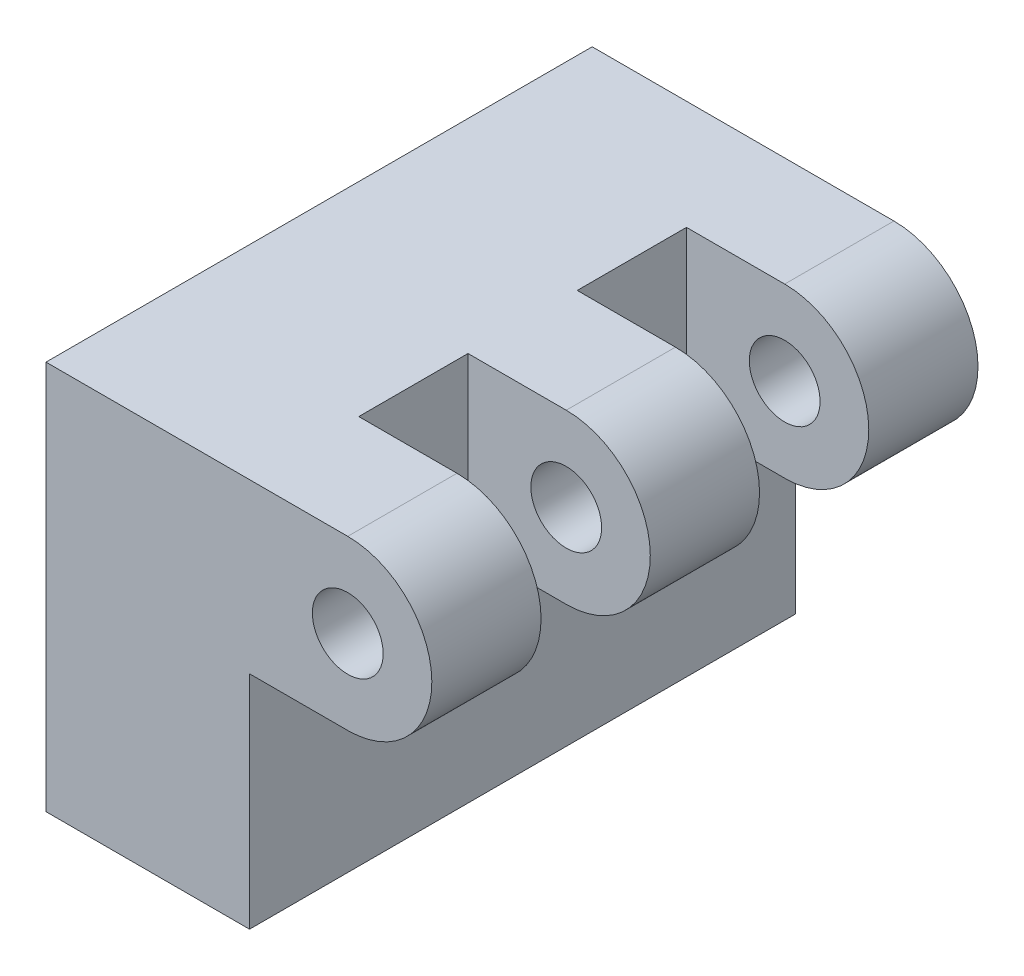
ISO-10303-21;
HEADER;
FILE_DESCRIPTION(('STEP AP214'),'2;1');
FILE_NAME('part.step','',(''),(''),'','','');
FILE_SCHEMA(('AUTOMOTIVE_DESIGN { 1 0 10303 214 1 1 1 1 }'));
ENDSEC;
DATA;
#1=APPLICATION_CONTEXT('core data for automotive mechanical design processes');
#2=APPLICATION_PROTOCOL_DEFINITION('international standard','automotive_design',2000,#1);
#3=PRODUCT_CONTEXT('',#1,'mechanical');
#4=PRODUCT('Part','Part','',(#3));
#5=PRODUCT_RELATED_PRODUCT_CATEGORY('part','',(#4));
#6=PRODUCT_DEFINITION_FORMATION('','',#4);
#7=PRODUCT_DEFINITION_CONTEXT('part definition',#1,'design');
#8=PRODUCT_DEFINITION('design','',#6,#7);
#9=PRODUCT_DEFINITION_SHAPE('','',#8);
#10=(LENGTH_UNIT() NAMED_UNIT(*) SI_UNIT(.MILLI.,.METRE.));
#11=(NAMED_UNIT(*) PLANE_ANGLE_UNIT() SI_UNIT($,.RADIAN.));
#12=(NAMED_UNIT(*) SI_UNIT($,.STERADIAN.) SOLID_ANGLE_UNIT());
#13=UNCERTAINTY_MEASURE_WITH_UNIT(LENGTH_MEASURE(1.E-05),#10,'distance_accuracy_value','');
#14=(GEOMETRIC_REPRESENTATION_CONTEXT(3) GLOBAL_UNCERTAINTY_ASSIGNED_CONTEXT((#13)) GLOBAL_UNIT_ASSIGNED_CONTEXT((#10,
#11,#12)) REPRESENTATION_CONTEXT('',''));
#15=CARTESIAN_POINT('',(0.,0.,0.));
#16=DIRECTION('',(0.,0.,1.));
#17=DIRECTION('',(1.,0.,0.));
#18=AXIS2_PLACEMENT_3D('',#15,#16,#17);
#19=CARTESIAN_POINT('',(24.85,11.,-7.71499999999989));
#20=DIRECTION('',(-1.,0.,0.));
#21=DIRECTION('',(0.,0.,1.));
#22=AXIS2_PLACEMENT_3D('',#19,#20,#21);
#23=PLANE('',#22);
#24=DIRECTION('',(0.,1.,0.));
#25=VECTOR('',#24,1.);
#26=CARTESIAN_POINT('',(24.85,0.,4.62900000000011));
#27=LINE('',#26,#25);
#28=CARTESIAN_POINT('',(24.85,6.25017318058128,4.62900000000011));
#29=VERTEX_POINT('',#28);
#30=CARTESIAN_POINT('',(24.85,11.,4.62900000000012));
#31=VERTEX_POINT('',#30);
#32=EDGE_CURVE('E156',#29,#31,#27,.T.);
#33=ORIENTED_EDGE('',*,*,#32,.F.);
#34=DIRECTION('',(0.,0.,1.));
#35=VECTOR('',#34,1.);
#36=CARTESIAN_POINT('',(24.85,6.25017318058128,4.62900000000011));
#37=LINE('',#36,#35);
#38=CARTESIAN_POINT('',(24.85,6.25017318058128,7.71500000000011));
#39=VERTEX_POINT('',#38);
#40=EDGE_CURVE('E166',#29,#39,#37,.T.);
#41=ORIENTED_EDGE('',*,*,#40,.T.);
#42=DIRECTION('',(0.,-1.,0.));
#43=VECTOR('',#42,1.);
#44=CARTESIAN_POINT('',(24.85,11.,7.71500000000011));
#45=LINE('',#44,#43);
#46=CARTESIAN_POINT('',(24.85,0.,7.71500000000011));
#47=VERTEX_POINT('',#46);
#48=EDGE_CURVE('E255',#39,#47,#45,.T.);
#49=ORIENTED_EDGE('',*,*,#48,.T.);
#50=DIRECTION('',(0.,0.,-1.));
#51=VECTOR('',#50,1.);
#52=CARTESIAN_POINT('',(24.85,0.,-7.71499999999989));
#53=LINE('',#52,#51);
#54=CARTESIAN_POINT('',(24.85,0.,-7.71499999999989));
#55=VERTEX_POINT('',#54);
#56=EDGE_CURVE('E242',#47,#55,#53,.T.);
#57=ORIENTED_EDGE('',*,*,#56,.T.);
#58=DIRECTION('',(0.,-1.,0.));
#59=VECTOR('',#58,1.);
#60=CARTESIAN_POINT('',(24.85,11.,-7.71499999999989));
#61=LINE('',#60,#59);
#62=CARTESIAN_POINT('',(24.85,6.25017318058128,-7.71499999999989));
#63=VERTEX_POINT('',#62);
#64=EDGE_CURVE('E11',#63,#55,#61,.T.);
#65=ORIENTED_EDGE('',*,*,#64,.F.);
#66=DIRECTION('',(0.,0.,-1.));
#67=VECTOR('',#66,1.);
#68=CARTESIAN_POINT('',(24.85,6.25017318058128,-4.62899999999989));
#69=LINE('',#68,#67);
#70=CARTESIAN_POINT('',(24.85,6.25017318058128,-4.62899999999989));
#71=VERTEX_POINT('',#70);
#72=EDGE_CURVE('E243',#71,#63,#69,.T.);
#73=ORIENTED_EDGE('',*,*,#72,.F.);
#74=DIRECTION('',(0.,1.,0.));
#75=VECTOR('',#74,1.);
#76=CARTESIAN_POINT('',(24.85,11.,-4.62899999999989));
#77=LINE('',#76,#75);
#78=CARTESIAN_POINT('',(24.85,11.,-4.62899999999989));
#79=VERTEX_POINT('',#78);
#80=EDGE_CURVE('E228',#71,#79,#77,.T.);
#81=ORIENTED_EDGE('',*,*,#80,.T.);
#82=DIRECTION('',(0.,0.,-1.));
#83=VECTOR('',#82,1.);
#84=CARTESIAN_POINT('',(24.85,11.,-7.71499999999989));
#85=LINE('',#84,#83);
#86=CARTESIAN_POINT('',(24.85,11.,-1.543));
#87=VERTEX_POINT('',#86);
#88=EDGE_CURVE('E249',#87,#79,#85,.T.);
#89=ORIENTED_EDGE('',*,*,#88,.F.);
#90=DIRECTION('',(0.,-1.,0.));
#91=VECTOR('',#90,1.);
#92=CARTESIAN_POINT('',(24.85,11.,-1.543));
#93=LINE('',#92,#91);
#94=CARTESIAN_POINT('',(24.85,6.25017318058128,-1.543));
#95=VERTEX_POINT('',#94);
#96=EDGE_CURVE('E67',#87,#95,#93,.T.);
#97=ORIENTED_EDGE('',*,*,#96,.T.);
#98=DIRECTION('',(0.,0.,-1.));
#99=VECTOR('',#98,1.);
#100=CARTESIAN_POINT('',(24.85,6.25017318058128,1.543));
#101=LINE('',#100,#99);
#102=CARTESIAN_POINT('',(24.85,6.25017318058128,1.543));
#103=VERTEX_POINT('',#102);
#104=EDGE_CURVE('E209',#103,#95,#101,.T.);
#105=ORIENTED_EDGE('',*,*,#104,.F.);
#106=DIRECTION('',(0.,-1.,0.));
#107=VECTOR('',#106,1.);
#108=CARTESIAN_POINT('',(24.85,11.,1.543));
#109=LINE('',#108,#107);
#110=CARTESIAN_POINT('',(24.85,11.,1.543));
#111=VERTEX_POINT('',#110);
#112=EDGE_CURVE('E196',#111,#103,#109,.T.);
#113=ORIENTED_EDGE('',*,*,#112,.F.);
#114=EDGE_CURVE('E246',#31,#111,#85,.T.);
#115=ORIENTED_EDGE('',*,*,#114,.F.);
#116=EDGE_LOOP('',(#33,#41,#49,#57,#65,#73,#81,#89,#97,#105,#113,#115));
#117=FACE_BOUND('',#116,.T.);
#118=ADVANCED_FACE('F45',(#117),#23,.F.);
#119=CARTESIAN_POINT('',(19.1,11.,-7.71499999999989));
#120=DIRECTION('',(0.,0.,1.));
#121=DIRECTION('',(1.,0.,0.));
#122=AXIS2_PLACEMENT_3D('',#119,#120,#121);
#123=PLANE('',#122);
#124=DIRECTION('',(-1.,0.,0.));
#125=VECTOR('',#124,1.);
#126=CARTESIAN_POINT('',(19.1,0.,-7.71499999999989));
#127=LINE('',#126,#125);
#128=CARTESIAN_POINT('',(19.1,0.,-7.71499999999989));
#129=VERTEX_POINT('',#128);
#130=EDGE_CURVE('E258',#55,#129,#127,.T.);
#131=ORIENTED_EDGE('',*,*,#130,.T.);
#132=DIRECTION('',(0.,-1.,0.));
#133=VECTOR('',#132,1.);
#134=CARTESIAN_POINT('',(19.1,11.,-7.71499999999989));
#135=LINE('',#134,#133);
#136=CARTESIAN_POINT('',(19.1,11.,-7.71499999999989));
#137=VERTEX_POINT('',#136);
#138=EDGE_CURVE('E52',#137,#129,#135,.T.);
#139=ORIENTED_EDGE('',*,*,#138,.F.);
#140=DIRECTION('',(-1.,0.,0.));
#141=VECTOR('',#140,1.);
#142=CARTESIAN_POINT('',(19.1,11.,-7.71499999999989));
#143=LINE('',#142,#141);
#144=CARTESIAN_POINT('',(27.625,11.,-7.71499999999989));
#145=VERTEX_POINT('',#144);
#146=EDGE_CURVE('E248',#145,#137,#143,.T.);
#147=ORIENTED_EDGE('',*,*,#146,.F.);
#148=CARTESIAN_POINT('',(27.625,8.625,-7.71499999999989));
#149=DIRECTION('',(0.,0.,-1.));
#150=DIRECTION('',(-1.,0.,0.));
#151=AXIS2_PLACEMENT_3D('',#148,#149,#150);
#152=CIRCLE('',#151,2.375);
#153=CARTESIAN_POINT('',(27.6536806166181,6.25017318058128,-7.71499999999989));
#154=VERTEX_POINT('',#153);
#155=EDGE_CURVE('E218',#145,#154,#152,.T.);
#156=ORIENTED_EDGE('',*,*,#155,.T.);
#157=DIRECTION('',(-1.,0.,0.));
#158=VECTOR('',#157,1.);
#159=CARTESIAN_POINT('',(27.6536806166181,6.25017318058128,-7.71499999999989));
#160=LINE('',#159,#158);
#161=EDGE_CURVE('E225',#154,#63,#160,.T.);
#162=ORIENTED_EDGE('',*,*,#161,.T.);
#163=ORIENTED_EDGE('',*,*,#64,.T.);
#164=EDGE_LOOP('',(#131,#139,#147,#156,#162,#163));
#165=FACE_BOUND('',#164,.T.);
#166=CARTESIAN_POINT('',(27.625,8.625,-7.71499999999989));
#167=DIRECTION('',(0.,0.,-1.));
#168=DIRECTION('',(-1.,0.,0.));
#169=AXIS2_PLACEMENT_3D('',#166,#167,#168);
#170=CIRCLE('',#169,1.);
#171=CARTESIAN_POINT('',(26.625,8.625,-7.71499999999989));
#172=VERTEX_POINT('',#171);
#173=EDGE_CURVE('E214',#172,#172,#170,.T.);
#174=ORIENTED_EDGE('',*,*,#173,.F.);
#175=EDGE_LOOP('',(#174));
#176=FACE_BOUND('',#175,.T.);
#177=ADVANCED_FACE('F288',(#165,#176),#123,.F.);
#178=CARTESIAN_POINT('',(19.1,11.,-7.71499999999989));
#179=DIRECTION('',(1.,0.,0.));
#180=DIRECTION('',(0.,0.,-1.));
#181=AXIS2_PLACEMENT_3D('',#178,#179,#180);
#182=PLANE('',#181);
#183=DIRECTION('',(0.,0.,1.));
#184=VECTOR('',#183,1.);
#185=CARTESIAN_POINT('',(19.1,0.,-7.71499999999989));
#186=LINE('',#185,#184);
#187=CARTESIAN_POINT('',(19.1,0.,7.71500000000011));
#188=VERTEX_POINT('',#187);
#189=EDGE_CURVE('E260',#129,#188,#186,.T.);
#190=ORIENTED_EDGE('',*,*,#189,.T.);
#191=DIRECTION('',(0.,-1.,0.));
#192=VECTOR('',#191,1.);
#193=CARTESIAN_POINT('',(19.1,11.,7.71500000000011));
#194=LINE('',#193,#192);
#195=CARTESIAN_POINT('',(19.1,11.,7.71500000000011));
#196=VERTEX_POINT('',#195);
#197=EDGE_CURVE('E266',#196,#188,#194,.T.);
#198=ORIENTED_EDGE('',*,*,#197,.F.);
#199=DIRECTION('',(0.,0.,1.));
#200=VECTOR('',#199,1.);
#201=CARTESIAN_POINT('',(19.1,11.,-7.71499999999989));
#202=LINE('',#201,#200);
#203=EDGE_CURVE('E251',#137,#196,#202,.T.);
#204=ORIENTED_EDGE('',*,*,#203,.F.);
#205=ORIENTED_EDGE('',*,*,#138,.T.);
#206=EDGE_LOOP('',(#190,#198,#204,#205));
#207=FACE_BOUND('',#206,.T.);
#208=ADVANCED_FACE('F273',(#207),#182,.F.);
#209=CARTESIAN_POINT('',(19.1,11.,7.71500000000011));
#210=DIRECTION('',(0.,0.,-1.));
#211=DIRECTION('',(-1.,0.,0.));
#212=AXIS2_PLACEMENT_3D('',#209,#210,#211);
#213=PLANE('',#212);
#214=DIRECTION('',(1.,0.,0.));
#215=VECTOR('',#214,1.);
#216=CARTESIAN_POINT('',(19.1,0.,7.71500000000011));
#217=LINE('',#216,#215);
#218=EDGE_CURVE('E262',#188,#47,#217,.T.);
#219=ORIENTED_EDGE('',*,*,#218,.T.);
#220=ORIENTED_EDGE('',*,*,#48,.F.);
#221=DIRECTION('',(1.,0.,0.));
#222=VECTOR('',#221,1.);
#223=CARTESIAN_POINT('',(0.,6.25017318058129,7.71500000000011));
#224=LINE('',#223,#222);
#225=CARTESIAN_POINT('',(27.6536806166181,6.25017318058128,7.71500000000011));
#226=VERTEX_POINT('',#225);
#227=EDGE_CURVE('E177',#39,#226,#224,.T.);
#228=ORIENTED_EDGE('',*,*,#227,.T.);
#229=CARTESIAN_POINT('',(27.625,8.625,7.71500000000011));
#230=DIRECTION('',(0.,0.,1.));
#231=DIRECTION('',(1.,0.,0.));
#232=AXIS2_PLACEMENT_3D('',#229,#230,#231);
#233=CIRCLE('',#232,2.375);
#234=CARTESIAN_POINT('',(27.625,11.,7.71500000000011));
#235=VERTEX_POINT('',#234);
#236=EDGE_CURVE('E151',#226,#235,#233,.T.);
#237=ORIENTED_EDGE('',*,*,#236,.T.);
#238=DIRECTION('',(1.,0.,0.));
#239=VECTOR('',#238,1.);
#240=CARTESIAN_POINT('',(19.1,11.,7.71500000000011));
#241=LINE('',#240,#239);
#242=EDGE_CURVE('E253',#196,#235,#241,.T.);
#243=ORIENTED_EDGE('',*,*,#242,.F.);
#244=ORIENTED_EDGE('',*,*,#197,.T.);
#245=EDGE_LOOP('',(#219,#220,#228,#237,#243,#244));
#246=FACE_BOUND('',#245,.T.);
#247=CARTESIAN_POINT('',(27.625,8.625,7.71500000000011));
#248=DIRECTION('',(0.,0.,1.));
#249=DIRECTION('',(1.,0.,0.));
#250=AXIS2_PLACEMENT_3D('',#247,#248,#249);
#251=CIRCLE('',#250,1.00000000000001);
#252=CARTESIAN_POINT('',(28.625,8.625,7.71500000000011));
#253=VERTEX_POINT('',#252);
#254=EDGE_CURVE('E174',#253,#253,#251,.T.);
#255=ORIENTED_EDGE('',*,*,#254,.F.);
#256=EDGE_LOOP('',(#255));
#257=FACE_BOUND('',#256,.T.);
#258=ADVANCED_FACE('F283',(#246,#257),#213,.F.);
#259=CARTESIAN_POINT('',(0.,11.,0.));
#260=DIRECTION('',(0.,1.,0.));
#261=DIRECTION('',(0.,0.,1.));
#262=AXIS2_PLACEMENT_3D('',#259,#260,#261);
#263=PLANE('',#262);
#264=ORIENTED_EDGE('',*,*,#242,.T.);
#265=DIRECTION('',(0.,0.,1.));
#266=VECTOR('',#265,1.);
#267=CARTESIAN_POINT('',(27.625,11.,4.62900000000011));
#268=LINE('',#267,#266);
#269=CARTESIAN_POINT('',(27.625,11.,4.62900000000011));
#270=VERTEX_POINT('',#269);
#271=EDGE_CURVE('E155',#270,#235,#268,.T.);
#272=ORIENTED_EDGE('',*,*,#271,.F.);
#273=DIRECTION('',(-1.,0.,0.));
#274=VECTOR('',#273,1.);
#275=CARTESIAN_POINT('',(0.,11.,4.62900000000011));
#276=LINE('',#275,#274);
#277=EDGE_CURVE('E59',#270,#31,#276,.T.);
#278=ORIENTED_EDGE('',*,*,#277,.T.);
#279=ORIENTED_EDGE('',*,*,#114,.T.);
#280=DIRECTION('',(-1.,0.,0.));
#281=VECTOR('',#280,1.);
#282=CARTESIAN_POINT('',(27.625,11.,1.543));
#283=LINE('',#282,#281);
#284=CARTESIAN_POINT('',(27.625,11.,1.543));
#285=VERTEX_POINT('',#284);
#286=EDGE_CURVE('E192',#285,#111,#283,.T.);
#287=ORIENTED_EDGE('',*,*,#286,.F.);
#288=DIRECTION('',(0.,0.,-1.));
#289=VECTOR('',#288,1.);
#290=CARTESIAN_POINT('',(27.625,11.,1.543));
#291=LINE('',#290,#289);
#292=CARTESIAN_POINT('',(27.625,11.,-1.543));
#293=VERTEX_POINT('',#292);
#294=EDGE_CURVE('E211',#285,#293,#291,.T.);
#295=ORIENTED_EDGE('',*,*,#294,.T.);
#296=DIRECTION('',(-1.,0.,0.));
#297=VECTOR('',#296,1.);
#298=CARTESIAN_POINT('',(27.625,11.,-1.543));
#299=LINE('',#298,#297);
#300=EDGE_CURVE('E203',#293,#87,#299,.T.);
#301=ORIENTED_EDGE('',*,*,#300,.T.);
#302=ORIENTED_EDGE('',*,*,#88,.T.);
#303=DIRECTION('',(1.,0.,0.));
#304=VECTOR('',#303,1.);
#305=CARTESIAN_POINT('',(27.625,11.,-4.62899999999989));
#306=LINE('',#305,#304);
#307=CARTESIAN_POINT('',(27.625,11.,-4.62899999999989));
#308=VERTEX_POINT('',#307);
#309=EDGE_CURVE('E231',#79,#308,#306,.T.);
#310=ORIENTED_EDGE('',*,*,#309,.T.);
#311=DIRECTION('',(0.,0.,-1.));
#312=VECTOR('',#311,1.);
#313=CARTESIAN_POINT('',(27.625,11.,-4.62899999999989));
#314=LINE('',#313,#312);
#315=EDGE_CURVE('E239',#308,#145,#314,.T.);
#316=ORIENTED_EDGE('',*,*,#315,.T.);
#317=ORIENTED_EDGE('',*,*,#146,.T.);
#318=ORIENTED_EDGE('',*,*,#203,.T.);
#319=EDGE_LOOP('',(#264,#272,#278,#279,#287,#295,#301,#302,#310,#316,#317,#318));
#320=FACE_BOUND('',#319,.T.);
#321=ADVANCED_FACE('F286',(#320),#263,.T.);
#322=CARTESIAN_POINT('',(0.,0.,0.));
#323=DIRECTION('',(0.,1.,0.));
#324=DIRECTION('',(0.,0.,1.));
#325=AXIS2_PLACEMENT_3D('',#322,#323,#324);
#326=PLANE('',#325);
#327=ORIENTED_EDGE('',*,*,#56,.F.);
#328=ORIENTED_EDGE('',*,*,#218,.F.);
#329=ORIENTED_EDGE('',*,*,#189,.F.);
#330=ORIENTED_EDGE('',*,*,#130,.F.);
#331=EDGE_LOOP('',(#327,#328,#329,#330));
#332=FACE_BOUND('',#331,.T.);
#333=ADVANCED_FACE('F280',(#332),#326,.F.);
#334=CARTESIAN_POINT('',(27.625,8.625,-4.62899999999989));
#335=DIRECTION('',(0.,0.,-1.));
#336=DIRECTION('',(-1.,0.,0.));
#337=AXIS2_PLACEMENT_3D('',#334,#335,#336);
#338=CYLINDRICAL_SURFACE('',#337,2.375);
#339=ORIENTED_EDGE('',*,*,#155,.F.);
#340=ORIENTED_EDGE('',*,*,#315,.F.);
#341=CARTESIAN_POINT('',(27.625,8.625,-4.62899999999989));
#342=DIRECTION('',(0.,0.,-1.));
#343=DIRECTION('',(-1.,0.,0.));
#344=AXIS2_PLACEMENT_3D('',#341,#342,#343);
#345=CIRCLE('',#344,2.375);
#346=CARTESIAN_POINT('',(27.6536806166181,6.25017318058128,-4.62899999999989));
#347=VERTEX_POINT('',#346);
#348=EDGE_CURVE('E221',#308,#347,#345,.T.);
#349=ORIENTED_EDGE('',*,*,#348,.T.);
#350=DIRECTION('',(0.,0.,-1.));
#351=VECTOR('',#350,1.);
#352=CARTESIAN_POINT('',(27.6536806166181,6.25017318058128,-4.62899999999989));
#353=LINE('',#352,#351);
#354=EDGE_CURVE('E234',#347,#154,#353,.T.);
#355=ORIENTED_EDGE('',*,*,#354,.T.);
#356=EDGE_LOOP('',(#339,#340,#349,#355));
#357=FACE_BOUND('',#356,.T.);
#358=ADVANCED_FACE('F293',(#357),#338,.T.);
#359=CARTESIAN_POINT('',(27.6536806166181,6.25017318058128,-4.62899999999989));
#360=DIRECTION('',(0.,-1.,0.));
#361=DIRECTION('',(0.,0.,-1.));
#362=AXIS2_PLACEMENT_3D('',#359,#360,#361);
#363=PLANE('',#362);
#364=ORIENTED_EDGE('',*,*,#161,.F.);
#365=ORIENTED_EDGE('',*,*,#354,.F.);
#366=DIRECTION('',(-1.,0.,0.));
#367=VECTOR('',#366,1.);
#368=CARTESIAN_POINT('',(27.6536806166181,6.25017318058128,-4.62899999999989));
#369=LINE('',#368,#367);
#370=EDGE_CURVE('E224',#347,#71,#369,.T.);
#371=ORIENTED_EDGE('',*,*,#370,.T.);
#372=ORIENTED_EDGE('',*,*,#72,.T.);
#373=EDGE_LOOP('',(#364,#365,#371,#372));
#374=FACE_BOUND('',#373,.T.);
#375=ADVANCED_FACE('F297',(#374),#363,.T.);
#376=CARTESIAN_POINT('',(27.625,8.625,-4.62899999999989));
#377=DIRECTION('',(0.,0.,-1.));
#378=DIRECTION('',(-1.,0.,0.));
#379=AXIS2_PLACEMENT_3D('',#376,#377,#378);
#380=PLANE('',#379);
#381=CARTESIAN_POINT('',(27.625,8.625,-4.62899999999989));
#382=DIRECTION('',(0.,0.,-1.));
#383=DIRECTION('',(-1.,0.,0.));
#384=AXIS2_PLACEMENT_3D('',#381,#382,#383);
#385=CIRCLE('',#384,1.);
#386=CARTESIAN_POINT('',(26.625,8.625,-4.62899999999989));
#387=VERTEX_POINT('',#386);
#388=EDGE_CURVE('E215',#387,#387,#385,.T.);
#389=ORIENTED_EDGE('',*,*,#388,.T.);
#390=EDGE_LOOP('',(#389));
#391=FACE_BOUND('',#390,.T.);
#392=ORIENTED_EDGE('',*,*,#348,.F.);
#393=ORIENTED_EDGE('',*,*,#309,.F.);
#394=ORIENTED_EDGE('',*,*,#80,.F.);
#395=ORIENTED_EDGE('',*,*,#370,.F.);
#396=EDGE_LOOP('',(#392,#393,#394,#395));
#397=FACE_BOUND('',#396,.T.);
#398=ADVANCED_FACE('F355',(#391,#397),#380,.F.);
#399=CARTESIAN_POINT('',(27.625,8.625,-4.62899999999989));
#400=DIRECTION('',(0.,0.,-1.));
#401=DIRECTION('',(-1.,0.,0.));
#402=AXIS2_PLACEMENT_3D('',#399,#400,#401);
#403=CYLINDRICAL_SURFACE('',#402,1.);
#404=ORIENTED_EDGE('',*,*,#388,.F.);
#405=EDGE_LOOP('',(#404));
#406=FACE_BOUND('',#405,.T.);
#407=ORIENTED_EDGE('',*,*,#173,.T.);
#408=EDGE_LOOP('',(#407));
#409=FACE_BOUND('',#408,.T.);
#410=ADVANCED_FACE('F358',(#406,#409),#403,.F.);
#411=CARTESIAN_POINT('',(27.625,8.625,1.543));
#412=DIRECTION('',(0.,0.,1.));
#413=DIRECTION('',(1.,0.,0.));
#414=AXIS2_PLACEMENT_3D('',#411,#412,#413);
#415=PLANE('',#414);
#416=CARTESIAN_POINT('',(27.625,8.625,1.543));
#417=DIRECTION('',(0.,0.,1.));
#418=DIRECTION('',(1.,0.,0.));
#419=AXIS2_PLACEMENT_3D('',#416,#417,#418);
#420=CIRCLE('',#419,2.375);
#421=CARTESIAN_POINT('',(27.6536806166181,6.25017318058128,1.543));
#422=VERTEX_POINT('',#421);
#423=EDGE_CURVE('E189',#422,#285,#420,.T.);
#424=ORIENTED_EDGE('',*,*,#423,.T.);
#425=ORIENTED_EDGE('',*,*,#286,.T.);
#426=ORIENTED_EDGE('',*,*,#112,.T.);
#427=DIRECTION('',(1.,0.,0.));
#428=VECTOR('',#427,1.);
#429=CARTESIAN_POINT('',(24.85,6.25017318058128,1.543));
#430=LINE('',#429,#428);
#431=EDGE_CURVE('E198',#103,#422,#430,.T.);
#432=ORIENTED_EDGE('',*,*,#431,.T.);
#433=EDGE_LOOP('',(#424,#425,#426,#432));
#434=FACE_BOUND('',#433,.T.);
#435=CARTESIAN_POINT('',(27.625,8.625,1.543));
#436=DIRECTION('',(0.,0.,1.));
#437=DIRECTION('',(1.,0.,0.));
#438=AXIS2_PLACEMENT_3D('',#435,#436,#437);
#439=CIRCLE('',#438,1.);
#440=CARTESIAN_POINT('',(28.625,8.625,1.543));
#441=VERTEX_POINT('',#440);
#442=EDGE_CURVE('E183',#441,#441,#439,.T.);
#443=ORIENTED_EDGE('',*,*,#442,.F.);
#444=EDGE_LOOP('',(#443));
#445=FACE_BOUND('',#444,.T.);
#446=ADVANCED_FACE('F305',(#434,#445),#415,.T.);
#447=CARTESIAN_POINT('',(27.625,8.625,-1.543));
#448=DIRECTION('',(0.,0.,1.));
#449=DIRECTION('',(1.,0.,0.));
#450=AXIS2_PLACEMENT_3D('',#447,#448,#449);
#451=PLANE('',#450);
#452=CARTESIAN_POINT('',(27.625,8.625,-1.543));
#453=DIRECTION('',(0.,0.,1.));
#454=DIRECTION('',(1.,0.,0.));
#455=AXIS2_PLACEMENT_3D('',#452,#453,#454);
#456=CIRCLE('',#455,2.375);
#457=CARTESIAN_POINT('',(27.6536806166181,6.25017318058128,-1.543));
#458=VERTEX_POINT('',#457);
#459=EDGE_CURVE('E186',#458,#293,#456,.T.);
#460=ORIENTED_EDGE('',*,*,#459,.F.);
#461=DIRECTION('',(1.,0.,0.));
#462=VECTOR('',#461,1.);
#463=CARTESIAN_POINT('',(24.85,6.25017318058128,-1.543));
#464=LINE('',#463,#462);
#465=EDGE_CURVE('E193',#95,#458,#464,.T.);
#466=ORIENTED_EDGE('',*,*,#465,.F.);
#467=ORIENTED_EDGE('',*,*,#96,.F.);
#468=ORIENTED_EDGE('',*,*,#300,.F.);
#469=EDGE_LOOP('',(#460,#466,#467,#468));
#470=FACE_BOUND('',#469,.T.);
#471=CARTESIAN_POINT('',(27.625,8.625,-1.543));
#472=DIRECTION('',(0.,0.,1.));
#473=DIRECTION('',(1.,0.,0.));
#474=AXIS2_PLACEMENT_3D('',#471,#472,#473);
#475=CIRCLE('',#474,1.);
#476=CARTESIAN_POINT('',(28.625,8.625,-1.543));
#477=VERTEX_POINT('',#476);
#478=EDGE_CURVE('E181',#477,#477,#475,.T.);
#479=ORIENTED_EDGE('',*,*,#478,.T.);
#480=EDGE_LOOP('',(#479));
#481=FACE_BOUND('',#480,.T.);
#482=ADVANCED_FACE('F317',(#470,#481),#451,.F.);
#483=CARTESIAN_POINT('',(27.625,8.625,1.543));
#484=DIRECTION('',(0.,0.,-1.));
#485=DIRECTION('',(-1.,0.,0.));
#486=AXIS2_PLACEMENT_3D('',#483,#484,#485);
#487=CYLINDRICAL_SURFACE('',#486,2.375);
#488=ORIENTED_EDGE('',*,*,#459,.T.);
#489=ORIENTED_EDGE('',*,*,#294,.F.);
#490=ORIENTED_EDGE('',*,*,#423,.F.);
#491=DIRECTION('',(0.,0.,-1.));
#492=VECTOR('',#491,1.);
#493=CARTESIAN_POINT('',(27.6536806166181,6.25017318058128,1.543));
#494=LINE('',#493,#492);
#495=EDGE_CURVE('E200',#422,#458,#494,.T.);
#496=ORIENTED_EDGE('',*,*,#495,.T.);
#497=EDGE_LOOP('',(#488,#489,#490,#496));
#498=FACE_BOUND('',#497,.T.);
#499=ADVANCED_FACE('F312',(#498),#487,.T.);
#500=CARTESIAN_POINT('',(24.85,6.25017318058128,1.543));
#501=DIRECTION('',(0.,1.,0.));
#502=DIRECTION('',(-1.,0.,0.));
#503=AXIS2_PLACEMENT_3D('',#500,#501,#502);
#504=PLANE('',#503);
#505=ORIENTED_EDGE('',*,*,#465,.T.);
#506=ORIENTED_EDGE('',*,*,#495,.F.);
#507=ORIENTED_EDGE('',*,*,#431,.F.);
#508=ORIENTED_EDGE('',*,*,#104,.T.);
#509=EDGE_LOOP('',(#505,#506,#507,#508));
#510=FACE_BOUND('',#509,.T.);
#511=ADVANCED_FACE('F316',(#510),#504,.F.);
#512=CARTESIAN_POINT('',(27.625,8.625,1.543));
#513=DIRECTION('',(0.,0.,-1.));
#514=DIRECTION('',(-1.,0.,0.));
#515=AXIS2_PLACEMENT_3D('',#512,#513,#514);
#516=CYLINDRICAL_SURFACE('',#515,1.);
#517=ORIENTED_EDGE('',*,*,#442,.T.);
#518=EDGE_LOOP('',(#517));
#519=FACE_BOUND('',#518,.T.);
#520=ORIENTED_EDGE('',*,*,#478,.F.);
#521=EDGE_LOOP('',(#520));
#522=FACE_BOUND('',#521,.T.);
#523=ADVANCED_FACE('F323',(#519,#522),#516,.F.);
#524=CARTESIAN_POINT('',(0.,6.25017318058129,4.62900000000011));
#525=DIRECTION('',(0.,-1.,0.));
#526=DIRECTION('',(1.,0.,0.));
#527=AXIS2_PLACEMENT_3D('',#524,#525,#526);
#528=PLANE('',#527);
#529=ORIENTED_EDGE('',*,*,#227,.F.);
#530=ORIENTED_EDGE('',*,*,#40,.F.);
#531=DIRECTION('',(1.,0.,0.));
#532=VECTOR('',#531,1.);
#533=CARTESIAN_POINT('',(0.,6.25017318058129,4.62900000000011));
#534=LINE('',#533,#532);
#535=CARTESIAN_POINT('',(27.6536806166181,6.25017318058128,4.62900000000011));
#536=VERTEX_POINT('',#535);
#537=EDGE_CURVE('E161',#29,#536,#534,.T.);
#538=ORIENTED_EDGE('',*,*,#537,.T.);
#539=DIRECTION('',(0.,0.,1.));
#540=VECTOR('',#539,1.);
#541=CARTESIAN_POINT('',(27.6536806166181,6.25017318058128,4.62900000000011));
#542=LINE('',#541,#540);
#543=EDGE_CURVE('E145',#536,#226,#542,.T.);
#544=ORIENTED_EDGE('',*,*,#543,.T.);
#545=EDGE_LOOP('',(#529,#530,#538,#544));
#546=FACE_BOUND('',#545,.T.);
#547=ADVANCED_FACE('F164',(#546),#528,.T.);
#548=CARTESIAN_POINT('',(27.625,8.625,4.62900000000011));
#549=DIRECTION('',(0.,0.,1.));
#550=DIRECTION('',(1.,0.,0.));
#551=AXIS2_PLACEMENT_3D('',#548,#549,#550);
#552=CYLINDRICAL_SURFACE('',#551,1.00000000000001);
#553=CARTESIAN_POINT('',(27.625,8.625,4.62900000000011));
#554=DIRECTION('',(0.,0.,1.));
#555=DIRECTION('',(1.,0.,0.));
#556=AXIS2_PLACEMENT_3D('',#553,#554,#555);
#557=CIRCLE('',#556,1.00000000000001);
#558=CARTESIAN_POINT('',(28.625,8.625,4.62900000000011));
#559=VERTEX_POINT('',#558);
#560=EDGE_CURVE('E167',#559,#559,#557,.T.);
#561=ORIENTED_EDGE('',*,*,#560,.F.);
#562=EDGE_LOOP('',(#561));
#563=FACE_BOUND('',#562,.T.);
#564=ORIENTED_EDGE('',*,*,#254,.T.);
#565=EDGE_LOOP('',(#564));
#566=FACE_BOUND('',#565,.T.);
#567=ADVANCED_FACE('F332',(#563,#566),#552,.F.);
#568=CARTESIAN_POINT('',(27.625,8.625,4.62900000000011));
#569=DIRECTION('',(0.,0.,1.));
#570=DIRECTION('',(1.,0.,0.));
#571=AXIS2_PLACEMENT_3D('',#568,#569,#570);
#572=CYLINDRICAL_SURFACE('',#571,2.375);
#573=ORIENTED_EDGE('',*,*,#236,.F.);
#574=ORIENTED_EDGE('',*,*,#543,.F.);
#575=CARTESIAN_POINT('',(27.625,8.625,4.62900000000011));
#576=DIRECTION('',(0.,0.,1.));
#577=DIRECTION('',(1.,0.,0.));
#578=AXIS2_PLACEMENT_3D('',#575,#576,#577);
#579=CIRCLE('',#578,2.375);
#580=EDGE_CURVE('E149',#536,#270,#579,.T.);
#581=ORIENTED_EDGE('',*,*,#580,.T.);
#582=ORIENTED_EDGE('',*,*,#271,.T.);
#583=EDGE_LOOP('',(#573,#574,#581,#582));
#584=FACE_BOUND('',#583,.T.);
#585=ADVANCED_FACE('F147',(#584),#572,.T.);
#586=CARTESIAN_POINT('',(0.,0.,4.62900000000011));
#587=DIRECTION('',(0.,0.,1.));
#588=DIRECTION('',(1.,0.,0.));
#589=AXIS2_PLACEMENT_3D('',#586,#587,#588);
#590=PLANE('',#589);
#591=ORIENTED_EDGE('',*,*,#560,.T.);
#592=EDGE_LOOP('',(#591));
#593=FACE_BOUND('',#592,.T.);
#594=ORIENTED_EDGE('',*,*,#537,.F.);
#595=ORIENTED_EDGE('',*,*,#32,.T.);
#596=ORIENTED_EDGE('',*,*,#277,.F.);
#597=ORIENTED_EDGE('',*,*,#580,.F.);
#598=EDGE_LOOP('',(#594,#595,#596,#597));
#599=FACE_BOUND('',#598,.T.);
#600=ADVANCED_FACE('F160',(#593,#599),#590,.F.);
#601=CLOSED_SHELL('',(#118,#177,#208,#258,#321,#333,#358,#375,#398,#410,#446,#482,#499,#511,
#523,#547,#567,#585,#600));
#602=MANIFOLD_SOLID_BREP('B2',#601);
#603=ADVANCED_BREP_SHAPE_REPRESENTATION('',(#18,#602),#14);
#604=SHAPE_DEFINITION_REPRESENTATION(#9,#603);
ENDSEC;
END-ISO-10303-21;
